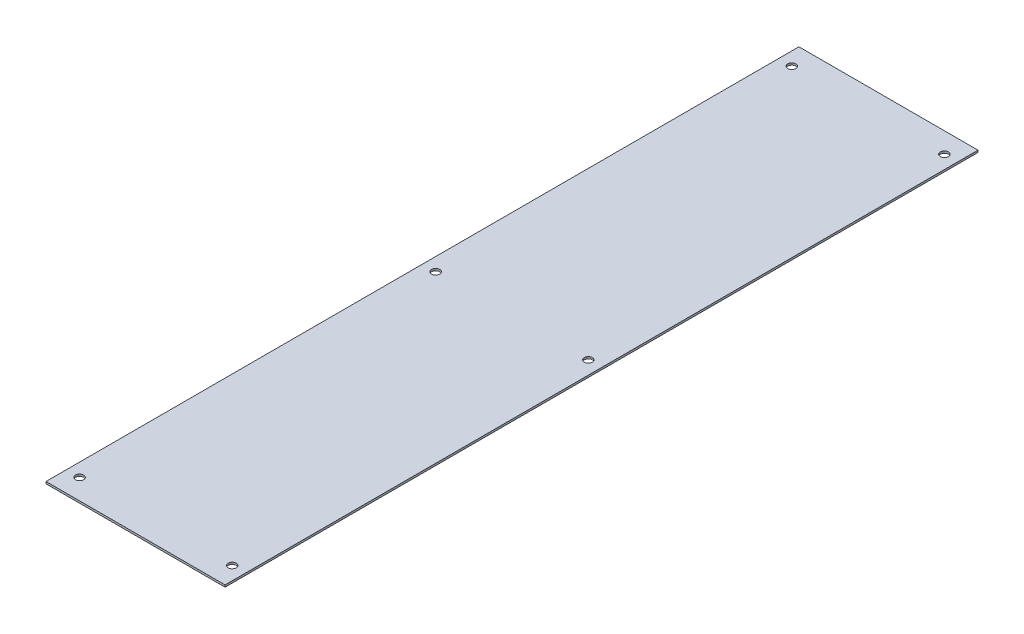
ISO-10303-21;
HEADER;
FILE_DESCRIPTION(('STEP AP214'),'2;1');
FILE_NAME('part.step','',(''),(''),'','','');
FILE_SCHEMA(('AUTOMOTIVE_DESIGN { 1 0 10303 214 1 1 1 1 }'));
ENDSEC;
DATA;
#1=APPLICATION_CONTEXT('core data for automotive mechanical design processes');
#2=APPLICATION_PROTOCOL_DEFINITION('international standard','automotive_design',2000,#1);
#3=PRODUCT_CONTEXT('',#1,'mechanical');
#4=PRODUCT('Part','Part','',(#3));
#5=PRODUCT_RELATED_PRODUCT_CATEGORY('part','',(#4));
#6=PRODUCT_DEFINITION_FORMATION('','',#4);
#7=PRODUCT_DEFINITION_CONTEXT('part definition',#1,'design');
#8=PRODUCT_DEFINITION('design','',#6,#7);
#9=PRODUCT_DEFINITION_SHAPE('','',#8);
#10=(LENGTH_UNIT() NAMED_UNIT(*) SI_UNIT(.MILLI.,.METRE.));
#11=(NAMED_UNIT(*) PLANE_ANGLE_UNIT() SI_UNIT($,.RADIAN.));
#12=(NAMED_UNIT(*) SI_UNIT($,.STERADIAN.) SOLID_ANGLE_UNIT());
#13=UNCERTAINTY_MEASURE_WITH_UNIT(LENGTH_MEASURE(1.E-05),#10,'distance_accuracy_value','');
#14=(GEOMETRIC_REPRESENTATION_CONTEXT(3) GLOBAL_UNCERTAINTY_ASSIGNED_CONTEXT((#13)) GLOBAL_UNIT_ASSIGNED_CONTEXT((#10,
#11,#12)) REPRESENTATION_CONTEXT('',''));
#15=CARTESIAN_POINT('',(0.,0.,0.));
#16=DIRECTION('',(0.,0.,1.));
#17=DIRECTION('',(1.,0.,0.));
#18=AXIS2_PLACEMENT_3D('',#15,#16,#17);
#19=CARTESIAN_POINT('',(0.,0.,0.));
#20=DIRECTION('',(0.,1.,0.));
#21=DIRECTION('',(1.,0.,0.));
#22=AXIS2_PLACEMENT_3D('',#19,#20,#21);
#23=PLANE('',#22);
#24=CARTESIAN_POINT('',(-37.5,0.,0.));
#25=DIRECTION('',(0.,1.,0.));
#26=DIRECTION('',(1.,0.,0.));
#27=AXIS2_PLACEMENT_3D('',#24,#25,#26);
#28=CIRCLE('',#27,2.);
#29=CARTESIAN_POINT('',(-39.5,0.,0.));
#30=VERTEX_POINT('',#29);
#31=EDGE_CURVE('E155',#30,#30,#28,.T.);
#32=ORIENTED_EDGE('',*,*,#31,.T.);
#33=EDGE_LOOP('',(#32));
#34=FACE_BOUND('',#33,.T.);
#35=CARTESIAN_POINT('',(37.5,0.,-175.));
#36=DIRECTION('',(0.,1.,0.));
#37=DIRECTION('',(1.,0.,0.));
#38=AXIS2_PLACEMENT_3D('',#35,#36,#37);
#39=CIRCLE('',#38,2.);
#40=CARTESIAN_POINT('',(35.5,0.,-175.));
#41=VERTEX_POINT('',#40);
#42=EDGE_CURVE('E127',#41,#41,#39,.T.);
#43=ORIENTED_EDGE('',*,*,#42,.T.);
#44=EDGE_LOOP('',(#43));
#45=FACE_BOUND('',#44,.T.);
#46=CARTESIAN_POINT('',(37.5,0.,175.));
#47=DIRECTION('',(0.,1.,0.));
#48=DIRECTION('',(1.,0.,0.));
#49=AXIS2_PLACEMENT_3D('',#46,#47,#48);
#50=CIRCLE('',#49,2.);
#51=CARTESIAN_POINT('',(35.5,0.,175.));
#52=VERTEX_POINT('',#51);
#53=EDGE_CURVE('E133',#52,#52,#50,.T.);
#54=ORIENTED_EDGE('',*,*,#53,.T.);
#55=EDGE_LOOP('',(#54));
#56=FACE_BOUND('',#55,.T.);
#57=CARTESIAN_POINT('',(-37.5,0.,175.));
#58=DIRECTION('',(0.,1.,0.));
#59=DIRECTION('',(1.,0.,0.));
#60=AXIS2_PLACEMENT_3D('',#57,#58,#59);
#61=CIRCLE('',#60,2.);
#62=CARTESIAN_POINT('',(-39.5,0.,175.));
#63=VERTEX_POINT('',#62);
#64=EDGE_CURVE('E108',#63,#63,#61,.T.);
#65=ORIENTED_EDGE('',*,*,#64,.T.);
#66=EDGE_LOOP('',(#65));
#67=FACE_BOUND('',#66,.T.);
#68=CARTESIAN_POINT('',(37.5,0.,0.));
#69=DIRECTION('',(0.,1.,0.));
#70=DIRECTION('',(1.,0.,0.));
#71=AXIS2_PLACEMENT_3D('',#68,#69,#70);
#72=CIRCLE('',#71,2.);
#73=CARTESIAN_POINT('',(35.5,0.,0.));
#74=VERTEX_POINT('',#73);
#75=EDGE_CURVE('E120',#74,#74,#72,.T.);
#76=ORIENTED_EDGE('',*,*,#75,.T.);
#77=EDGE_LOOP('',(#76));
#78=FACE_BOUND('',#77,.T.);
#79=CARTESIAN_POINT('',(-37.5,0.,-175.));
#80=DIRECTION('',(0.,1.,0.));
#81=DIRECTION('',(1.,0.,0.));
#82=AXIS2_PLACEMENT_3D('',#79,#80,#81);
#83=CIRCLE('',#82,2.);
#84=CARTESIAN_POINT('',(-39.5,0.,-175.));
#85=VERTEX_POINT('',#84);
#86=EDGE_CURVE('E83',#85,#85,#83,.T.);
#87=ORIENTED_EDGE('',*,*,#86,.T.);
#88=EDGE_LOOP('',(#87));
#89=FACE_BOUND('',#88,.T.);
#90=DIRECTION('',(0.,0.,1.));
#91=VECTOR('',#90,1.);
#92=CARTESIAN_POINT('',(-44.,0.,-185.));
#93=LINE('',#92,#91);
#94=CARTESIAN_POINT('',(-44.,0.,-185.));
#95=VERTEX_POINT('',#94);
#96=CARTESIAN_POINT('',(-44.,0.,185.));
#97=VERTEX_POINT('',#96);
#98=EDGE_CURVE('E28',#95,#97,#93,.T.);
#99=ORIENTED_EDGE('',*,*,#98,.F.);
#100=DIRECTION('',(-1.,0.,0.));
#101=VECTOR('',#100,1.);
#102=CARTESIAN_POINT('',(44.,0.,-185.));
#103=LINE('',#102,#101);
#104=CARTESIAN_POINT('',(44.,0.,-185.));
#105=VERTEX_POINT('',#104);
#106=EDGE_CURVE('E159',#105,#95,#103,.T.);
#107=ORIENTED_EDGE('',*,*,#106,.F.);
#108=DIRECTION('',(0.,0.,-1.));
#109=VECTOR('',#108,1.);
#110=CARTESIAN_POINT('',(44.,0.,185.));
#111=LINE('',#110,#109);
#112=CARTESIAN_POINT('',(44.,0.,185.));
#113=VERTEX_POINT('',#112);
#114=EDGE_CURVE('E114',#113,#105,#111,.T.);
#115=ORIENTED_EDGE('',*,*,#114,.F.);
#116=DIRECTION('',(1.,0.,0.));
#117=VECTOR('',#116,1.);
#118=CARTESIAN_POINT('',(-44.,0.,185.));
#119=LINE('',#118,#117);
#120=EDGE_CURVE('E122',#97,#113,#119,.T.);
#121=ORIENTED_EDGE('',*,*,#120,.F.);
#122=EDGE_LOOP('',(#99,#107,#115,#121));
#123=FACE_BOUND('',#122,.T.);
#124=ADVANCED_FACE('F17',(#34,#45,#56,#67,#78,#89,#123),#23,.F.);
#125=CARTESIAN_POINT('',(0.,1.,0.));
#126=DIRECTION('',(0.,1.,0.));
#127=DIRECTION('',(1.,0.,0.));
#128=AXIS2_PLACEMENT_3D('',#125,#126,#127);
#129=PLANE('',#128);
#130=CARTESIAN_POINT('',(-37.5,1.,0.));
#131=DIRECTION('',(0.,-1.,0.));
#132=DIRECTION('',(1.,0.,0.));
#133=AXIS2_PLACEMENT_3D('',#130,#131,#132);
#134=CIRCLE('',#133,2.);
#135=CARTESIAN_POINT('',(-39.5,1.,0.));
#136=VERTEX_POINT('',#135);
#137=EDGE_CURVE('E131',#136,#136,#134,.T.);
#138=ORIENTED_EDGE('',*,*,#137,.T.);
#139=EDGE_LOOP('',(#138));
#140=FACE_BOUND('',#139,.T.);
#141=CARTESIAN_POINT('',(37.5,1.,-175.));
#142=DIRECTION('',(0.,-1.,0.));
#143=DIRECTION('',(1.,0.,0.));
#144=AXIS2_PLACEMENT_3D('',#141,#142,#143);
#145=CIRCLE('',#144,2.);
#146=CARTESIAN_POINT('',(35.5,1.,-175.));
#147=VERTEX_POINT('',#146);
#148=EDGE_CURVE('E137',#147,#147,#145,.T.);
#149=ORIENTED_EDGE('',*,*,#148,.T.);
#150=EDGE_LOOP('',(#149));
#151=FACE_BOUND('',#150,.T.);
#152=CARTESIAN_POINT('',(37.5,1.,175.));
#153=DIRECTION('',(0.,-1.,0.));
#154=DIRECTION('',(1.,0.,0.));
#155=AXIS2_PLACEMENT_3D('',#152,#153,#154);
#156=CIRCLE('',#155,2.);
#157=CARTESIAN_POINT('',(35.5,1.,175.));
#158=VERTEX_POINT('',#157);
#159=EDGE_CURVE('E141',#158,#158,#156,.T.);
#160=ORIENTED_EDGE('',*,*,#159,.T.);
#161=EDGE_LOOP('',(#160));
#162=FACE_BOUND('',#161,.T.);
#163=CARTESIAN_POINT('',(-37.5,1.,175.));
#164=DIRECTION('',(0.,-1.,0.));
#165=DIRECTION('',(1.,0.,0.));
#166=AXIS2_PLACEMENT_3D('',#163,#164,#165);
#167=CIRCLE('',#166,2.);
#168=CARTESIAN_POINT('',(-39.5,1.,175.));
#169=VERTEX_POINT('',#168);
#170=EDGE_CURVE('E109',#169,#169,#167,.T.);
#171=ORIENTED_EDGE('',*,*,#170,.T.);
#172=EDGE_LOOP('',(#171));
#173=FACE_BOUND('',#172,.T.);
#174=CARTESIAN_POINT('',(37.5,1.,0.));
#175=DIRECTION('',(0.,-1.,0.));
#176=DIRECTION('',(1.,0.,0.));
#177=AXIS2_PLACEMENT_3D('',#174,#175,#176);
#178=CIRCLE('',#177,2.);
#179=CARTESIAN_POINT('',(35.5,1.,0.));
#180=VERTEX_POINT('',#179);
#181=EDGE_CURVE('E121',#180,#180,#178,.T.);
#182=ORIENTED_EDGE('',*,*,#181,.T.);
#183=EDGE_LOOP('',(#182));
#184=FACE_BOUND('',#183,.T.);
#185=CARTESIAN_POINT('',(-37.5,1.,-175.));
#186=DIRECTION('',(0.,-1.,0.));
#187=DIRECTION('',(1.,0.,0.));
#188=AXIS2_PLACEMENT_3D('',#185,#186,#187);
#189=CIRCLE('',#188,2.);
#190=CARTESIAN_POINT('',(-39.5,1.,-175.));
#191=VERTEX_POINT('',#190);
#192=EDGE_CURVE('E92',#191,#191,#189,.T.);
#193=ORIENTED_EDGE('',*,*,#192,.T.);
#194=EDGE_LOOP('',(#193));
#195=FACE_BOUND('',#194,.T.);
#196=DIRECTION('',(0.,0.,1.));
#197=VECTOR('',#196,1.);
#198=CARTESIAN_POINT('',(-44.,1.,-185.));
#199=LINE('',#198,#197);
#200=CARTESIAN_POINT('',(-44.,1.,-185.));
#201=VERTEX_POINT('',#200);
#202=CARTESIAN_POINT('',(-44.,1.,185.));
#203=VERTEX_POINT('',#202);
#204=EDGE_CURVE('E11',#201,#203,#199,.T.);
#205=ORIENTED_EDGE('',*,*,#204,.T.);
#206=DIRECTION('',(1.,0.,0.));
#207=VECTOR('',#206,1.);
#208=CARTESIAN_POINT('',(-44.,1.,185.));
#209=LINE('',#208,#207);
#210=CARTESIAN_POINT('',(44.,1.,185.));
#211=VERTEX_POINT('',#210);
#212=EDGE_CURVE('E126',#203,#211,#209,.T.);
#213=ORIENTED_EDGE('',*,*,#212,.T.);
#214=DIRECTION('',(0.,0.,-1.));
#215=VECTOR('',#214,1.);
#216=CARTESIAN_POINT('',(44.,1.,185.));
#217=LINE('',#216,#215);
#218=CARTESIAN_POINT('',(44.,1.,-185.));
#219=VERTEX_POINT('',#218);
#220=EDGE_CURVE('E213',#211,#219,#217,.T.);
#221=ORIENTED_EDGE('',*,*,#220,.T.);
#222=DIRECTION('',(-1.,0.,0.));
#223=VECTOR('',#222,1.);
#224=CARTESIAN_POINT('',(44.,1.,-185.));
#225=LINE('',#224,#223);
#226=EDGE_CURVE('E115',#219,#201,#225,.T.);
#227=ORIENTED_EDGE('',*,*,#226,.T.);
#228=EDGE_LOOP('',(#205,#213,#221,#227));
#229=FACE_BOUND('',#228,.T.);
#230=ADVANCED_FACE('F95',(#140,#151,#162,#173,#184,#195,#229),#129,.T.);
#231=CARTESIAN_POINT('',(-44.,0.,-185.));
#232=DIRECTION('',(-1.,0.,0.));
#233=DIRECTION('',(0.,1.,0.));
#234=AXIS2_PLACEMENT_3D('',#231,#232,#233);
#235=PLANE('',#234);
#236=ORIENTED_EDGE('',*,*,#98,.T.);
#237=DIRECTION('',(0.,1.,0.));
#238=VECTOR('',#237,1.);
#239=CARTESIAN_POINT('',(-44.,0.,185.));
#240=LINE('',#239,#238);
#241=EDGE_CURVE('E195',#97,#203,#240,.T.);
#242=ORIENTED_EDGE('',*,*,#241,.T.);
#243=ORIENTED_EDGE('',*,*,#204,.F.);
#244=DIRECTION('',(0.,1.,0.));
#245=VECTOR('',#244,1.);
#246=CARTESIAN_POINT('',(-44.,0.,-185.));
#247=LINE('',#246,#245);
#248=EDGE_CURVE('E163',#95,#201,#247,.T.);
#249=ORIENTED_EDGE('',*,*,#248,.F.);
#250=EDGE_LOOP('',(#236,#242,#243,#249));
#251=FACE_BOUND('',#250,.T.);
#252=ADVANCED_FACE('F198',(#251),#235,.T.);
#253=CARTESIAN_POINT('',(-44.,0.,185.));
#254=DIRECTION('',(0.,0.,1.));
#255=DIRECTION('',(1.,0.,0.));
#256=AXIS2_PLACEMENT_3D('',#253,#254,#255);
#257=PLANE('',#256);
#258=ORIENTED_EDGE('',*,*,#120,.T.);
#259=DIRECTION('',(0.,1.,0.));
#260=VECTOR('',#259,1.);
#261=CARTESIAN_POINT('',(44.,0.,185.));
#262=LINE('',#261,#260);
#263=EDGE_CURVE('E103',#113,#211,#262,.T.);
#264=ORIENTED_EDGE('',*,*,#263,.T.);
#265=ORIENTED_EDGE('',*,*,#212,.F.);
#266=ORIENTED_EDGE('',*,*,#241,.F.);
#267=EDGE_LOOP('',(#258,#264,#265,#266));
#268=FACE_BOUND('',#267,.T.);
#269=ADVANCED_FACE('F270',(#268),#257,.T.);
#270=CARTESIAN_POINT('',(44.,0.,185.));
#271=DIRECTION('',(1.,0.,0.));
#272=DIRECTION('',(0.,0.,-1.));
#273=AXIS2_PLACEMENT_3D('',#270,#271,#272);
#274=PLANE('',#273);
#275=ORIENTED_EDGE('',*,*,#114,.T.);
#276=DIRECTION('',(0.,1.,0.));
#277=VECTOR('',#276,1.);
#278=CARTESIAN_POINT('',(44.,0.,-185.));
#279=LINE('',#278,#277);
#280=EDGE_CURVE('E110',#105,#219,#279,.T.);
#281=ORIENTED_EDGE('',*,*,#280,.T.);
#282=ORIENTED_EDGE('',*,*,#220,.F.);
#283=ORIENTED_EDGE('',*,*,#263,.F.);
#284=EDGE_LOOP('',(#275,#281,#282,#283));
#285=FACE_BOUND('',#284,.T.);
#286=ADVANCED_FACE('F271',(#285),#274,.T.);
#287=CARTESIAN_POINT('',(44.,0.,-185.));
#288=DIRECTION('',(0.,0.,-1.));
#289=DIRECTION('',(0.,-1.,0.));
#290=AXIS2_PLACEMENT_3D('',#287,#288,#289);
#291=PLANE('',#290);
#292=ORIENTED_EDGE('',*,*,#106,.T.);
#293=ORIENTED_EDGE('',*,*,#248,.T.);
#294=ORIENTED_EDGE('',*,*,#226,.F.);
#295=ORIENTED_EDGE('',*,*,#280,.F.);
#296=EDGE_LOOP('',(#292,#293,#294,#295));
#297=FACE_BOUND('',#296,.T.);
#298=ADVANCED_FACE('F204',(#297),#291,.T.);
#299=CARTESIAN_POINT('',(-37.5,-379.322231798248,0.));
#300=DIRECTION('',(0.,1.,0.));
#301=DIRECTION('',(1.,0.,0.));
#302=AXIS2_PLACEMENT_3D('',#299,#300,#301);
#303=CYLINDRICAL_SURFACE('',#302,2.);
#304=ORIENTED_EDGE('',*,*,#137,.F.);
#305=DIRECTION('',(0.,-1.,0.));
#306=VECTOR('',#305,1.);
#307=CARTESIAN_POINT('',(-39.5,-379.322231798248,0.));
#308=LINE('',#307,#306);
#309=EDGE_CURVE('E145',#136,#30,#308,.T.);
#310=ORIENTED_EDGE('',*,*,#309,.T.);
#311=ORIENTED_EDGE('',*,*,#31,.F.);
#312=ORIENTED_EDGE('',*,*,#309,.F.);
#313=EDGE_LOOP('',(#304,#310,#311,#312));
#314=FACE_BOUND('',#313,.T.);
#315=ADVANCED_FACE('F19',(#314),#303,.F.);
#316=CARTESIAN_POINT('',(37.5,-379.322231798248,-175.));
#317=DIRECTION('',(0.,1.,0.));
#318=DIRECTION('',(1.,0.,0.));
#319=AXIS2_PLACEMENT_3D('',#316,#317,#318);
#320=CYLINDRICAL_SURFACE('',#319,2.);
#321=ORIENTED_EDGE('',*,*,#148,.F.);
#322=DIRECTION('',(0.,-1.,0.));
#323=VECTOR('',#322,1.);
#324=CARTESIAN_POINT('',(35.5,-379.322231798248,-175.));
#325=LINE('',#324,#323);
#326=EDGE_CURVE('E132',#147,#41,#325,.T.);
#327=ORIENTED_EDGE('',*,*,#326,.T.);
#328=ORIENTED_EDGE('',*,*,#42,.F.);
#329=ORIENTED_EDGE('',*,*,#326,.F.);
#330=EDGE_LOOP('',(#321,#327,#328,#329));
#331=FACE_BOUND('',#330,.T.);
#332=ADVANCED_FACE('F249',(#331),#320,.F.);
#333=CARTESIAN_POINT('',(37.5,-379.322231798248,175.));
#334=DIRECTION('',(0.,1.,0.));
#335=DIRECTION('',(1.,0.,0.));
#336=AXIS2_PLACEMENT_3D('',#333,#334,#335);
#337=CYLINDRICAL_SURFACE('',#336,2.);
#338=ORIENTED_EDGE('',*,*,#159,.F.);
#339=DIRECTION('',(0.,-1.,0.));
#340=VECTOR('',#339,1.);
#341=CARTESIAN_POINT('',(35.5,-379.322231798248,175.));
#342=LINE('',#341,#340);
#343=EDGE_CURVE('E138',#158,#52,#342,.T.);
#344=ORIENTED_EDGE('',*,*,#343,.T.);
#345=ORIENTED_EDGE('',*,*,#53,.F.);
#346=ORIENTED_EDGE('',*,*,#343,.F.);
#347=EDGE_LOOP('',(#338,#344,#345,#346));
#348=FACE_BOUND('',#347,.T.);
#349=ADVANCED_FACE('F171',(#348),#337,.F.);
#350=CARTESIAN_POINT('',(-37.5,-379.322231798248,175.));
#351=DIRECTION('',(0.,1.,0.));
#352=DIRECTION('',(1.,0.,0.));
#353=AXIS2_PLACEMENT_3D('',#350,#351,#352);
#354=CYLINDRICAL_SURFACE('',#353,2.);
#355=ORIENTED_EDGE('',*,*,#170,.F.);
#356=DIRECTION('',(0.,-1.,0.));
#357=VECTOR('',#356,1.);
#358=CARTESIAN_POINT('',(-39.5,-379.322231798248,175.));
#359=LINE('',#358,#357);
#360=EDGE_CURVE('E105',#169,#63,#359,.T.);
#361=ORIENTED_EDGE('',*,*,#360,.T.);
#362=ORIENTED_EDGE('',*,*,#64,.F.);
#363=ORIENTED_EDGE('',*,*,#360,.F.);
#364=EDGE_LOOP('',(#355,#361,#362,#363));
#365=FACE_BOUND('',#364,.T.);
#366=ADVANCED_FACE('F285',(#365),#354,.F.);
#367=CARTESIAN_POINT('',(37.5,-379.322231798248,0.));
#368=DIRECTION('',(0.,1.,0.));
#369=DIRECTION('',(1.,0.,0.));
#370=AXIS2_PLACEMENT_3D('',#367,#368,#369);
#371=CYLINDRICAL_SURFACE('',#370,2.);
#372=ORIENTED_EDGE('',*,*,#181,.F.);
#373=DIRECTION('',(0.,-1.,0.));
#374=VECTOR('',#373,1.);
#375=CARTESIAN_POINT('',(35.5,-379.322231798248,0.));
#376=LINE('',#375,#374);
#377=EDGE_CURVE('E116',#180,#74,#376,.T.);
#378=ORIENTED_EDGE('',*,*,#377,.T.);
#379=ORIENTED_EDGE('',*,*,#75,.F.);
#380=ORIENTED_EDGE('',*,*,#377,.F.);
#381=EDGE_LOOP('',(#372,#378,#379,#380));
#382=FACE_BOUND('',#381,.T.);
#383=ADVANCED_FACE('F282',(#382),#371,.F.);
#384=CARTESIAN_POINT('',(-37.5,-379.322231798248,-175.));
#385=DIRECTION('',(0.,1.,0.));
#386=DIRECTION('',(1.,0.,0.));
#387=AXIS2_PLACEMENT_3D('',#384,#385,#386);
#388=CYLINDRICAL_SURFACE('',#387,2.);
#389=ORIENTED_EDGE('',*,*,#192,.F.);
#390=DIRECTION('',(0.,-1.,0.));
#391=VECTOR('',#390,1.);
#392=CARTESIAN_POINT('',(-39.5,-379.322231798248,-175.));
#393=LINE('',#392,#391);
#394=EDGE_CURVE('E21',#191,#85,#393,.T.);
#395=ORIENTED_EDGE('',*,*,#394,.T.);
#396=ORIENTED_EDGE('',*,*,#86,.F.);
#397=ORIENTED_EDGE('',*,*,#394,.F.);
#398=EDGE_LOOP('',(#389,#395,#396,#397));
#399=FACE_BOUND('',#398,.T.);
#400=ADVANCED_FACE('F91',(#399),#388,.F.);
#401=CLOSED_SHELL('',(#124,#230,#252,#269,#286,#298,#315,#332,#349,#366,#383,#400));
#402=MANIFOLD_SOLID_BREP('B1',#401);
#403=ADVANCED_BREP_SHAPE_REPRESENTATION('',(#18,#402),#14);
#404=SHAPE_DEFINITION_REPRESENTATION(#9,#403);
ENDSEC;
END-ISO-10303-21;
